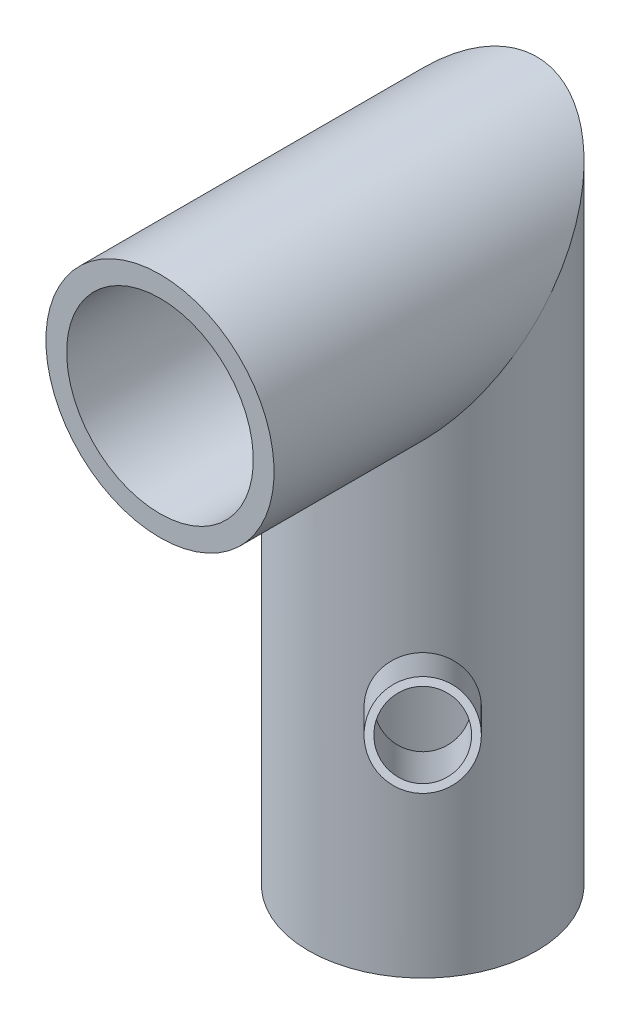
ISO-10303-21;
HEADER;
FILE_DESCRIPTION(('STEP AP214'),'2;1');
FILE_NAME('part.step','',(''),(''),'','','');
FILE_SCHEMA(('AUTOMOTIVE_DESIGN { 1 0 10303 214 1 1 1 1 }'));
ENDSEC;
DATA;
#1=APPLICATION_CONTEXT('core data for automotive mechanical design processes');
#2=APPLICATION_PROTOCOL_DEFINITION('international standard','automotive_design',2000,#1);
#3=PRODUCT_CONTEXT('',#1,'mechanical');
#4=PRODUCT('Part','Part','',(#3));
#5=PRODUCT_RELATED_PRODUCT_CATEGORY('part','',(#4));
#6=PRODUCT_DEFINITION_FORMATION('','',#4);
#7=PRODUCT_DEFINITION_CONTEXT('part definition',#1,'design');
#8=PRODUCT_DEFINITION('design','',#6,#7);
#9=PRODUCT_DEFINITION_SHAPE('','',#8);
#10=(LENGTH_UNIT() NAMED_UNIT(*) SI_UNIT(.MILLI.,.METRE.));
#11=(NAMED_UNIT(*) PLANE_ANGLE_UNIT() SI_UNIT($,.RADIAN.));
#12=(NAMED_UNIT(*) SI_UNIT($,.STERADIAN.) SOLID_ANGLE_UNIT());
#13=UNCERTAINTY_MEASURE_WITH_UNIT(LENGTH_MEASURE(1.E-05),#10,'distance_accuracy_value','');
#14=(GEOMETRIC_REPRESENTATION_CONTEXT(3) GLOBAL_UNCERTAINTY_ASSIGNED_CONTEXT((#13)) GLOBAL_UNIT_ASSIGNED_CONTEXT((#10,
#11,#12)) REPRESENTATION_CONTEXT('',''));
#15=CARTESIAN_POINT('',(0.,0.,0.));
#16=DIRECTION('',(0.,0.,1.));
#17=DIRECTION('',(1.,0.,0.));
#18=AXIS2_PLACEMENT_3D('',#15,#16,#17);
#19=CARTESIAN_POINT('',(0.,14.95,-38.));
#20=DIRECTION('',(0.,-1.,0.));
#21=DIRECTION('',(0.,0.,-1.));
#22=AXIS2_PLACEMENT_3D('',#19,#20,#21);
#23=CYLINDRICAL_SURFACE('',#22,13.5);
#24=CARTESIAN_POINT('',(12.4026078314168,-47.5303689872121,-32.6684599804486));
#25=CARTESIAN_POINT('',(12.4026074541691,-47.6854969967618,-32.6684603417958));
#26=CARTESIAN_POINT('',(12.400334372549,-47.8406194324453,-32.6631619201947));
#27=CARTESIAN_POINT('',(12.3909840963077,-48.1499320245815,-32.641487287225));
#28=CARTESIAN_POINT('',(12.3839079176055,-48.3041223712267,-32.6251134184634));
#29=CARTESIAN_POINT('',(12.3646204579696,-48.6106845041856,-32.5808908781653));
#30=CARTESIAN_POINT('',(12.3524044394549,-48.7630544790034,-32.5530316205989));
#31=CARTESIAN_POINT('',(12.3224671169421,-49.0645780364804,-32.4856402809017));
#32=CARTESIAN_POINT('',(12.3047484765567,-49.2137331380621,-32.4461138468707));
#33=CARTESIAN_POINT('',(12.2632667380413,-49.5085387002859,-32.3551081619502));
#34=CARTESIAN_POINT('',(12.2394667201007,-49.6541615833996,-32.303556076458));
#35=CARTESIAN_POINT('',(12.1854537929432,-49.9395776520134,-32.1889134354223));
#36=CARTESIAN_POINT('',(12.155240696561,-50.079370667227,-32.125822543127));
#37=CARTESIAN_POINT('',(12.0880206078433,-50.3516999511084,-31.988712327881));
#38=CARTESIAN_POINT('',(12.0510168948845,-50.4842396826499,-31.9146982833866));
#39=CARTESIAN_POINT('',(11.9698638507772,-50.7408390749606,-31.7565836887572));
#40=CARTESIAN_POINT('',(11.9257152175218,-50.8648995622738,-31.6724841239513));
#41=CARTESIAN_POINT('',(11.8347972884385,-51.0914568316449,-31.5041720250416));
#42=CARTESIAN_POINT('',(11.7887303840513,-51.1948697076169,-31.420810066597));
#43=CARTESIAN_POINT('',(11.6904756325528,-51.3931458907392,-31.2477652220097));
#44=CARTESIAN_POINT('',(11.6382879869771,-51.4880094792073,-31.158082544026));
#45=CARTESIAN_POINT('',(11.5277491947446,-51.6685468415771,-30.9734380377897));
#46=CARTESIAN_POINT('',(11.4693984258321,-51.75422117805,-30.8784765332508));
#47=CARTESIAN_POINT('',(11.3465636127386,-51.9158659434795,-30.6843535136399));
#48=CARTESIAN_POINT('',(11.2820795646457,-51.9918363662465,-30.5851919958891));
#49=CARTESIAN_POINT('',(11.1491907925894,-52.1314530480085,-30.3868964967247));
#50=CARTESIAN_POINT('',(11.0809694577194,-52.1954082320999,-30.2878568623697));
#51=CARTESIAN_POINT('',(10.9390399288838,-52.3135312475122,-30.0878291810284));
#52=CARTESIAN_POINT('',(10.8653299115801,-52.3676958057258,-29.9868404948957));
#53=CARTESIAN_POINT('',(10.7127329433701,-52.4659592990457,-29.7839511622829));
#54=CARTESIAN_POINT('',(10.6338479178096,-52.5100619506138,-29.6820508670137));
#55=CARTESIAN_POINT('',(10.4711841437759,-52.588067479258,-29.4781860205935));
#56=CARTESIAN_POINT('',(10.3874035854576,-52.6219665552873,-29.3762214596414));
#57=CARTESIAN_POINT('',(10.2144191902217,-52.6797416731073,-29.1719906508406));
#58=CARTESIAN_POINT('',(10.1251648422911,-52.7035003523885,-29.0697339718112));
#59=CARTESIAN_POINT('',(9.94257804384494,-52.7403570303557,-28.8668860715334));
#60=CARTESIAN_POINT('',(9.84924409352779,-52.7534510730264,-28.7662954818586));
#61=CARTESIAN_POINT('',(9.65914598360358,-52.7689160635626,-28.5676198563692));
#62=CARTESIAN_POINT('',(9.56238287579438,-52.7712902712331,-28.46953406789));
#63=CARTESIAN_POINT('',(9.36602836625288,-52.7653152624475,-28.2764988641334));
#64=CARTESIAN_POINT('',(9.26643593103245,-52.7569620769634,-28.1815506230522));
#65=CARTESIAN_POINT('',(9.06448702259583,-52.7294574375191,-27.9947952083692));
#66=CARTESIAN_POINT('',(8.96211601937286,-52.7102303217267,-27.9030148771585));
#67=CARTESIAN_POINT('',(8.75608001119253,-52.6609826959472,-27.7238280423705));
#68=CARTESIAN_POINT('',(8.65241453851432,-52.6309581688869,-27.63642318045));
#69=CARTESIAN_POINT('',(8.44476044935031,-52.5602421552339,-27.4665290032329));
#70=CARTESIAN_POINT('',(8.3407719630524,-52.5195545239491,-27.3840379245319));
#71=CARTESIAN_POINT('',(8.13335156550347,-52.4276525590633,-27.2242988869962));
#72=CARTESIAN_POINT('',(8.02991987239983,-52.3764343696624,-27.1470528624767));
#73=CARTESIAN_POINT('',(7.82497391174662,-52.2638750327092,-26.998374544241));
#74=CARTESIAN_POINT('',(7.7234547292238,-52.202565472313,-26.9269251166221));
#75=CARTESIAN_POINT('',(7.52304188151515,-52.0700012565373,-26.7897999647342));
#76=CARTESIAN_POINT('',(7.4241482220684,-51.998746579421,-26.7241242530852));
#77=CARTESIAN_POINT('',(7.23005569694352,-51.8466735334161,-26.5986998304025));
#78=CARTESIAN_POINT('',(7.13485619658613,-51.7658568170918,-26.5389500984799));
#79=CARTESIAN_POINT('',(6.94918022996923,-51.5951128657466,-26.4254270982168));
#80=CARTESIAN_POINT('',(6.85870381411513,-51.505185533526,-26.3716538936516));
#81=CARTESIAN_POINT('',(6.68458467795714,-51.3179564873399,-26.270706278384));
#82=CARTESIAN_POINT('',(6.60087041903308,-51.2207615405435,-26.223457492317));
#83=CARTESIAN_POINT('',(6.43992623531879,-51.0186794219643,-26.1346808503835));
#84=CARTESIAN_POINT('',(6.36269850584276,-50.9137896682563,-26.0931549283521));
#85=CARTESIAN_POINT('',(6.14210202507236,-50.588745601449,-25.9770122844505));
#86=CARTESIAN_POINT('',(6.00960944981806,-50.35799129665,-25.9107115709561));
#87=CARTESIAN_POINT('',(5.77873142359058,-49.875141079403,-25.7986519620855));
#88=CARTESIAN_POINT('',(5.68040484227466,-49.6230092529747,-25.752928482669));
#89=CARTESIAN_POINT('',(5.52012491089038,-49.1049302765901,-25.6798548812142));
#90=CARTESIAN_POINT('',(5.45818366669196,-48.8389785605763,-25.6525108738268));
#91=CARTESIAN_POINT('',(5.36704153470343,-48.2802896272205,-25.6126044783384));
#92=CARTESIAN_POINT('',(5.34059283572848,-47.9870237108228,-25.6012812682938));
#93=CARTESIAN_POINT('',(5.32640278543088,-47.3994949021746,-25.5951866373963));
#94=CARTESIAN_POINT('',(5.33867732826364,-47.1052316500774,-25.600422013103));
#95=CARTESIAN_POINT('',(5.40324072545171,-46.4718777907522,-25.628400362429));
#96=CARTESIAN_POINT('',(5.46191281261176,-46.1335724269655,-25.6539400372047));
#97=CARTESIAN_POINT('',(5.62135686566214,-45.4688686989215,-25.7257201379023));
#98=CARTESIAN_POINT('',(5.7221898998651,-45.1424883562417,-25.7719905984552));
#99=CARTESIAN_POINT('',(5.91225275122181,-44.6376974805767,-25.8632238912822));
#100=CARTESIAN_POINT('',(5.98939674128537,-44.4533042740524,-25.9009998885907));
#101=CARTESIAN_POINT('',(6.15598936012938,-44.0920237748887,-25.9849047217123));
#102=CARTESIAN_POINT('',(6.2454410939255,-43.9151383911152,-26.0310356662558));
#103=CARTESIAN_POINT('',(6.4358594255096,-43.57057446576,-26.1323408910982));
#104=CARTESIAN_POINT('',(6.53681574985254,-43.4028879049657,-26.1875071219633));
#105=CARTESIAN_POINT('',(6.74961335443817,-43.0784574827738,-26.3077954397259));
#106=CARTESIAN_POINT('',(6.86144937861573,-42.9217083996359,-26.3729127277875));
#107=CARTESIAN_POINT('',(7.13754393559966,-42.5672070879633,-26.5396311762954));
#108=CARTESIAN_POINT('',(7.30619376187534,-42.3749747804435,-26.6459321882974));
#109=CARTESIAN_POINT('',(7.65996402594364,-42.0226458161367,-26.8815485606488));
#110=CARTESIAN_POINT('',(7.84505452726815,-41.8624924114211,-27.0108225029612));
#111=CARTESIAN_POINT('',(8.18946166243426,-41.6120091999844,-27.2659954732622));
#112=CARTESIAN_POINT('',(8.34652594435429,-41.5141203922941,-27.3873950161002));
#113=CARTESIAN_POINT('',(8.58519875311291,-41.3918988171499,-27.5810312880686));
#114=CARTESIAN_POINT('',(8.6652854762031,-41.3552553468859,-27.6475140461362));
#115=CARTESIAN_POINT('',(8.82590530402713,-41.2908319266414,-27.784106214345));
#116=CARTESIAN_POINT('',(8.90643819518223,-41.2630480553546,-27.8542140040148));
#117=CARTESIAN_POINT('',(9.06786199905286,-41.2167577304496,-27.9982170823375));
#118=CARTESIAN_POINT('',(9.1487514237481,-41.1983181801433,-28.072135622064));
#119=CARTESIAN_POINT('',(9.30957707845439,-41.1714389634874,-28.2227861262555));
#120=CARTESIAN_POINT('',(9.38951331059243,-41.1629992748196,-28.2995180844409));
#121=CARTESIAN_POINT('',(9.54766159384255,-41.1563281168575,-28.4551342532596));
#122=CARTESIAN_POINT('',(9.62587406328277,-41.158094142805,-28.5340179310728));
#123=CARTESIAN_POINT('',(9.77989213205746,-41.1717846887576,-28.6932295171079));
#124=CARTESIAN_POINT('',(9.85569787112077,-41.1837086178971,-28.7735573410606));
#125=CARTESIAN_POINT('',(9.99648478976908,-41.2156511697138,-28.9264159965119));
#126=CARTESIAN_POINT('',(10.0617659573556,-41.2346866602824,-28.9988784170614));
#127=CARTESIAN_POINT('',(10.1896000199108,-41.2803087456312,-29.1438492250523));
#128=CARTESIAN_POINT('',(10.2521520701405,-41.3068976595471,-29.2163576197764));
#129=CARTESIAN_POINT('',(10.4352939525749,-41.3973444910672,-29.4331830924972));
#130=CARTESIAN_POINT('',(10.5514430690592,-41.4718999317028,-29.5768807422622));
#131=CARTESIAN_POINT('',(10.8097459491445,-41.6761668190758,-29.9093769353369));
#132=CARTESIAN_POINT('',(10.9464888088761,-41.8160629892657,-30.0960718982738));
#133=CARTESIAN_POINT('',(11.1970930302643,-42.1303679542441,-30.4552458200784));
#134=CARTESIAN_POINT('',(11.31090592612,-42.3048483361176,-30.6276942224771));
#135=CARTESIAN_POINT('',(11.5551207242683,-42.7476087389883,-31.0143900640029));
#136=CARTESIAN_POINT('',(11.6767913214403,-43.0270667032233,-31.2213948120239));
#137=CARTESIAN_POINT('',(11.835224293157,-43.4715237609032,-31.5046853812515));
#138=CARTESIAN_POINT('',(11.8840671829756,-43.6240859070818,-31.5946709598506));
#139=CARTESIAN_POINT('',(11.974400265294,-43.9365529803919,-31.7651735419386));
#140=CARTESIAN_POINT('',(12.0158913114453,-44.0964570523051,-31.8456916443675));
#141=CARTESIAN_POINT('',(12.0929776150367,-44.4264217610584,-31.9985507422124));
#142=CARTESIAN_POINT('',(12.1284053950368,-44.5966346929328,-32.0706459323219));
#143=CARTESIAN_POINT('',(12.1925708815713,-44.9426028706715,-32.2037362607105));
#144=CARTESIAN_POINT('',(12.2213077099216,-45.1183588406232,-32.264729941693));
#145=CARTESIAN_POINT('',(12.2723343812719,-45.4740278954434,-32.3747464292898));
#146=CARTESIAN_POINT('',(12.2946394829789,-45.6539300293391,-32.4237975248425));
#147=CARTESIAN_POINT('',(12.3330565161284,-46.0173528883812,-32.509288281249));
#148=CARTESIAN_POINT('',(12.3491689535069,-46.2008733166273,-32.5457289723394));
#149=CARTESIAN_POINT('',(12.3754968314798,-46.5745392040742,-32.6057272318372));
#150=CARTESIAN_POINT('',(12.3855771701625,-46.7647420990925,-32.6289890639318));
#151=CARTESIAN_POINT('',(12.3991344326744,-47.1467553632444,-32.6603587244741));
#152=CARTESIAN_POINT('',(12.4026082978515,-47.3385664356722,-32.6684595336737));
#153=CARTESIAN_POINT('',(12.4026078314168,-47.5303689872121,-32.6684599804486));
#154=B_SPLINE_CURVE_WITH_KNOTS('',3,(#24,#25,#26,#27,#28,#29,#30,#31,#32,#33,#34,#35,#36,#37,
#38,#39,#40,#41,#42,#43,#44,#45,#46,#47,#48,#49,#50,#51,#52,#53,#54,#55,#56,#57,#58,#59,#60,#61,
#62,#63,#64,#65,#66,#67,#68,#69,#70,#71,#72,#73,#74,#75,#76,#77,#78,#79,#80,#81,#82,#83,#84,#85,
#86,#87,#88,#89,#90,#91,#92,#93,#94,#95,#96,#97,#98,#99,#100,#101,#102,#103,#104,#105,#106,#107,
#108,#109,#110,#111,#112,#113,#114,#115,#116,#117,#118,#119,#120,#121,#122,#123,#124,#125,#126,
#127,#128,#129,#130,#131,#132,#133,#134,#135,#136,#137,#138,#139,#140,#141,#142,#143,#144,#145,
#146,#147,#148,#149,#150,#151,#152,#153),.UNSPECIFIED.,.T.,.F.,(4,2,2,2,2,2,2,2,2,2,2,2,2,2,2,2,
2,2,2,2,2,2,2,2,2,2,2,2,2,2,2,2,2,2,2,2,2,2,2,2,2,2,2,2,2,2,2,2,2,2,2,2,2,2,2,2,2,2,2,2,2,2,2,2,
4),(0.,0.465254941343188,0.930411505726324,1.39599776470033,1.8613590012054,2.32961548689747,
2.79788564049441,3.26593024574564,3.73392916145318,4.15517566250802,4.57640829721045,
4.99761512908205,5.41882222960997,5.82697834852706,6.23527066689253,6.64341193353689,
7.05170505376994,7.4646033199401,7.87765467982995,8.29058042606382,8.70365899470608,
9.1196478030535,9.53579153642565,9.95178501766551,10.3679310884698,10.7827985164037,
11.1976668511124,11.6124635904302,12.0272647556113,12.4368578019805,12.846588917918,
13.6650723525164,14.4849591605463,15.3051186011886,16.1857782205861,17.0667993583141,
18.0960104031645,19.1267174085563,19.7363877968111,20.3462122765918,20.9554963967019,
21.56448761515,22.3924303802783,23.2188953126581,23.8800072478935,24.2106960359563,
24.5412382555621,24.8741147833061,25.2069905681151,25.5397846596813,25.8725593945792,
26.1703385381352,26.4682092081415,27.0636235345366,27.8704612016278,28.6789867475518,
29.7780017533409,30.3288314978377,30.8795972413576,31.4437263828484,32.0079295243227,
32.5707829183475,33.133590317888,33.7085722278101,34.2838202769873),.UNSPECIFIED.);
#155=CARTESIAN_POINT('',(12.3926489596014,-48.0856946764748,-32.6453523211989));
#156=VERTEX_POINT('',#155);
#157=CARTESIAN_POINT('',(5.3546476788011,-48.0856946764748,-25.6073510403986));
#158=VERTEX_POINT('',#157);
#159=EDGE_CURVE('E70',#156,#158,#154,.T.);
#160=ORIENTED_EDGE('',*,*,#159,.F.);
#161=CARTESIAN_POINT('',(0.,-26.8211631573543,-38.));
#162=DIRECTION('',(0.60896972058243,0.508243798611957,0.608969720582432));
#163=DIRECTION('',(0.359382636494524,-0.861213237922228,0.359382636494525));
#164=AXIS2_PLACEMENT_3D('',#161,#162,#163);
#165=ELLIPSE('',#164,26.5620555270311,13.5);
#166=CARTESIAN_POINT('',(12.7891736212475,-47.3245213718715,-33.6771493102829));
#167=VERTEX_POINT('',#166);
#168=EDGE_CURVE('E64',#156,#167,#165,.T.);
#169=ORIENTED_EDGE('',*,*,#168,.T.);
#170=CARTESIAN_POINT('',(4.32285068971703,-47.3245213718714,-25.2108263787525));
#171=CARTESIAN_POINT('',(4.33049087348776,-47.1970837071915,-25.2134121435329));
#172=CARTESIAN_POINT('',(4.34115671539952,-47.0698773314985,-25.2170212349891));
#173=CARTESIAN_POINT('',(4.36826339454839,-46.8161804815477,-25.2262575092941));
#174=CARTESIAN_POINT('',(4.38470300278998,-46.689689860753,-25.2318842626715));
#175=CARTESIAN_POINT('',(4.44223057391352,-46.3118824044159,-25.2517351503151));
#176=CARTESIAN_POINT('',(4.49154627670616,-46.0619335488827,-25.2689360396316));
#177=CARTESIAN_POINT('',(4.61022953573521,-45.5667494213795,-25.3114322363188));
#178=CARTESIAN_POINT('',(4.67966280495566,-45.3215324516387,-25.3367540998791));
#179=CARTESIAN_POINT('',(4.83674197388976,-44.8379937038327,-25.3959144191036));
#180=CARTESIAN_POINT('',(4.92439250032019,-44.5996736949703,-25.4297550387756));
#181=CARTESIAN_POINT('',(5.11182313609656,-44.1426060742573,-25.5048425031274));
#182=CARTESIAN_POINT('',(5.21082404341832,-43.9234672907503,-25.5456584558186));
#183=CARTESIAN_POINT('',(5.42295775559721,-43.4941165961153,-25.6365518630977));
#184=CARTESIAN_POINT('',(5.53609060474737,-43.2839047129691,-25.6866293467137));
#185=CARTESIAN_POINT('',(5.77551029115772,-42.8742549325098,-25.7970967687386));
#186=CARTESIAN_POINT('',(5.9017810426554,-42.6748043035407,-25.8574741528068));
#187=CARTESIAN_POINT('',(6.16678033039424,-42.288559909502,-25.9898898336715));
#188=CARTESIAN_POINT('',(6.30550364639291,-42.1017608978328,-26.0619232542091));
#189=CARTESIAN_POINT('',(6.64385708914377,-41.6824727380925,-26.2459427084292));
#190=CARTESIAN_POINT('',(6.84818927491438,-41.4559694005607,-26.3631936864967));
#191=CARTESIAN_POINT('',(7.27519579344283,-41.0393548915769,-26.6252875716182));
#192=CARTESIAN_POINT('',(7.49783540644316,-40.8491770070207,-26.770078903974));
#193=CARTESIAN_POINT('',(7.90932785576645,-40.5515249274917,-27.0573522041801));
#194=CARTESIAN_POINT('',(8.09559795627285,-40.4350775853358,-27.1940718351037));
#195=CARTESIAN_POINT('',(8.37816033245533,-40.2885456107815,-27.4136540520406));
#196=CARTESIAN_POINT('',(8.47289423538207,-40.2443851380398,-27.4892826709557));
#197=CARTESIAN_POINT('',(8.66272340718244,-40.1662780148146,-27.6451809584265));
#198=CARTESIAN_POINT('',(8.75781849071722,-40.1323266965384,-27.7254484859222));
#199=CARTESIAN_POINT('',(8.94835040104432,-40.0751480573,-27.8909408372198));
#200=CARTESIAN_POINT('',(9.0437837778276,-40.0520096299478,-27.9762004844135));
#201=CARTESIAN_POINT('',(9.2333150017153,-40.0174352301393,-28.1505093953528));
#202=CARTESIAN_POINT('',(9.32741285453287,-40.0059992076071,-28.2395586428805));
#203=CARTESIAN_POINT('',(9.51331648505085,-39.9951336530155,-28.4206658163918));
#204=CARTESIAN_POINT('',(9.60512308002887,-39.9956997767666,-28.5127226417339));
#205=CARTESIAN_POINT('',(9.78561579703624,-40.008812814534,-28.6990032011851));
#206=CARTESIAN_POINT('',(9.87430213739011,-40.0213588885764,-28.79322678292));
#207=CARTESIAN_POINT('',(10.0374942689583,-40.0559120985559,-28.9716259368893));
#208=CARTESIAN_POINT('',(10.1124316465116,-40.0766156820721,-29.0556629011306));
#209=CARTESIAN_POINT('',(10.2589545618928,-40.1266607559985,-29.2241050473495));
#210=CARTESIAN_POINT('',(10.3305390620211,-40.156004900412,-29.3085103346007));
#211=CARTESIAN_POINT('',(10.539799525958,-40.2562487385747,-29.5613753131713));
#212=CARTESIAN_POINT('',(10.6720622585996,-40.3393775618788,-29.729571870855));
#213=CARTESIAN_POINT('',(10.9676288795921,-40.5696459911389,-30.1232962824087));
#214=CARTESIAN_POINT('',(11.1240284805883,-40.7290982577118,-30.3467259651775));
#215=CARTESIAN_POINT('',(11.4092257735473,-41.0880693892294,-30.7787167607425));
#216=CARTESIAN_POINT('',(11.5379624892182,-41.2876749262891,-30.9872443641405));
#217=CARTESIAN_POINT('',(11.7366842655702,-41.653810989748,-31.3271627385792));
#218=CARTESIAN_POINT('',(11.8128208947041,-41.8128427094788,-31.4632237507218));
#219=CARTESIAN_POINT('',(11.9542072322588,-42.1434724336142,-31.7255165912828));
#220=CARTESIAN_POINT('',(12.0194523143536,-42.3150757336561,-31.8517442307685));
#221=CARTESIAN_POINT('',(12.1402757728816,-42.6690206056962,-32.0938981012325));
#222=CARTESIAN_POINT('',(12.1958384978374,-42.8513789379082,-32.2098075076041));
#223=CARTESIAN_POINT('',(12.2982036098132,-43.2249903112227,-32.430531351533));
#224=CARTESIAN_POINT('',(12.3450072001501,-43.4162421260383,-32.5353473122305));
#225=CARTESIAN_POINT('',(12.4321369661881,-43.8127776847298,-32.7365056286127));
#226=CARTESIAN_POINT('',(12.4722017287037,-44.0183156975159,-32.8324595336384));
#227=CARTESIAN_POINT('',(12.5447117117264,-44.4364354620794,-33.0110626359786));
#228=CARTESIAN_POINT('',(12.5771557065583,-44.6490183406424,-33.0937096924339));
#229=CARTESIAN_POINT('',(12.6349256900127,-45.0795941357715,-33.2444606835483));
#230=CARTESIAN_POINT('',(12.6602701210896,-45.2975714037718,-33.3126021863299));
#231=CARTESIAN_POINT('',(12.7043299993098,-45.7383598423204,-33.4333683811116));
#232=CARTESIAN_POINT('',(12.7230484335481,-45.9611687864785,-33.4860000633652));
#233=CARTESIAN_POINT('',(12.7515007165986,-46.3735272281288,-33.5670790427137));
#234=CARTESIAN_POINT('',(12.7622068374655,-46.5625067897934,-33.5980824691405));
#235=CARTESIAN_POINT('',(12.7790944307858,-46.942322137143,-33.6473798785361));
#236=CARTESIAN_POINT('',(12.7852755619064,-47.1331580617588,-33.6656729027174));
#237=CARTESIAN_POINT('',(12.7891736212475,-47.3245213718714,-33.6771493102829));
#238=B_SPLINE_CURVE_WITH_KNOTS('',3,(#170,#171,#172,#173,#174,#175,#176,#177,#178,#179,#180,
#181,#182,#183,#184,#185,#186,#187,#188,#189,#190,#191,#192,#193,#194,#195,#196,#197,#198,#199,
#200,#201,#202,#203,#204,#205,#206,#207,#208,#209,#210,#211,#212,#213,#214,#215,#216,#217,#218,
#219,#220,#221,#222,#223,#224,#225,#226,#227,#228,#229,#230,#231,#232,#233,#234,#235,#236,#237),
.UNSPECIFIED.,.F.,.F.,(4,2,2,2,2,2,2,2,2,2,2,2,2,2,2,2,2,2,2,2,2,2,2,2,2,2,2,2,2,2,2,2,2,4),(0.,
0.382986735047625,0.765891997453906,1.53081482079575,2.29826494957203,3.06591022972714,
3.79689424090696,4.52788054323022,5.2579821453118,5.98777909806513,6.96504605035023,
7.94050058367176,8.71342411517325,9.10004841014998,9.4864956644445,9.87606634337762,
10.2656353552862,10.6550633646904,11.0444640713664,11.3875254338187,11.7306922798725,
12.4166703182656,13.3593384514433,14.3040636294133,14.9713788615511,15.6389768272076,
16.3076441475585,16.9762195398438,17.6666261569347,18.3571437386597,19.04585057548,
19.7342465367261,20.3091980028597,20.8841928347703),.UNSPECIFIED.);
#239=CARTESIAN_POINT('',(4.32285068971703,-47.3245213718714,-25.2108263787525));
#240=VERTEX_POINT('',#239);
#241=EDGE_CURVE('E77',#240,#167,#238,.T.);
#242=ORIENTED_EDGE('',*,*,#241,.F.);
#243=EDGE_CURVE('E12',#240,#158,#165,.T.);
#244=ORIENTED_EDGE('',*,*,#243,.T.);
#245=EDGE_LOOP('',(#160,#169,#242,#244));
#246=FACE_BOUND('',#245,.T.);
#247=CARTESIAN_POINT('',(0.,0.,-38.));
#248=DIRECTION('',(0.,-0.707106781186548,-0.707106781186548));
#249=DIRECTION('',(0.,0.707106781186548,-0.707106781186548));
#250=AXIS2_PLACEMENT_3D('',#247,#248,#249);
#251=ELLIPSE('',#250,19.0918830920368,13.5);
#252=CARTESIAN_POINT('',(0.,13.5,-51.5));
#253=VERTEX_POINT('',#252);
#254=EDGE_CURVE('E178',#253,#253,#251,.T.);
#255=ORIENTED_EDGE('',*,*,#254,.F.);
#256=EDGE_LOOP('',(#255));
#257=FACE_BOUND('',#256,.T.);
#258=CARTESIAN_POINT('',(0.,-79.,-38.));
#259=DIRECTION('',(0.,1.,0.));
#260=DIRECTION('',(0.,0.,1.));
#261=AXIS2_PLACEMENT_3D('',#258,#259,#260);
#262=CIRCLE('',#261,13.5);
#263=CARTESIAN_POINT('',(0.,-79.,-24.5));
#264=VERTEX_POINT('',#263);
#265=EDGE_CURVE('E138',#264,#264,#262,.T.);
#266=ORIENTED_EDGE('',*,*,#265,.F.);
#267=EDGE_LOOP('',(#266));
#268=FACE_BOUND('',#267,.T.);
#269=ADVANCED_FACE('F55',(#246,#257,#268),#23,.F.);
#270=CARTESIAN_POINT('',(0.,-79.,-38.));
#271=DIRECTION('',(0.,1.,0.));
#272=DIRECTION('',(0.,0.,1.));
#273=AXIS2_PLACEMENT_3D('',#270,#271,#272);
#274=PLANE('',#273);
#275=ORIENTED_EDGE('',*,*,#265,.T.);
#276=EDGE_LOOP('',(#275));
#277=FACE_BOUND('',#276,.T.);
#278=CARTESIAN_POINT('',(0.,-79.,-38.));
#279=DIRECTION('',(0.,1.,0.));
#280=DIRECTION('',(0.,0.,1.));
#281=AXIS2_PLACEMENT_3D('',#278,#279,#280);
#282=CIRCLE('',#281,16.5);
#283=CARTESIAN_POINT('',(0.,-79.,-21.5));
#284=VERTEX_POINT('',#283);
#285=EDGE_CURVE('E175',#284,#284,#282,.T.);
#286=ORIENTED_EDGE('',*,*,#285,.F.);
#287=EDGE_LOOP('',(#286));
#288=FACE_BOUND('',#287,.T.);
#289=ADVANCED_FACE('F149',(#277,#288),#274,.F.);
#290=CARTESIAN_POINT('',(0.,0.,0.));
#291=DIRECTION('',(0.,0.,1.));
#292=DIRECTION('',(0.,-1.,0.));
#293=AXIS2_PLACEMENT_3D('',#290,#291,#292);
#294=PLANE('',#293);
#295=CARTESIAN_POINT('',(0.,0.,0.));
#296=DIRECTION('',(0.,0.,1.));
#297=DIRECTION('',(0.,-1.,0.));
#298=AXIS2_PLACEMENT_3D('',#295,#296,#297);
#299=CIRCLE('',#298,13.5);
#300=CARTESIAN_POINT('',(0.,-13.5,0.));
#301=VERTEX_POINT('',#300);
#302=EDGE_CURVE('E141',#301,#301,#299,.T.);
#303=ORIENTED_EDGE('',*,*,#302,.F.);
#304=EDGE_LOOP('',(#303));
#305=FACE_BOUND('',#304,.T.);
#306=CARTESIAN_POINT('',(0.,0.,0.));
#307=DIRECTION('',(0.,0.,1.));
#308=DIRECTION('',(0.,-1.,0.));
#309=AXIS2_PLACEMENT_3D('',#306,#307,#308);
#310=CIRCLE('',#309,16.5);
#311=CARTESIAN_POINT('',(0.,-16.5,0.));
#312=VERTEX_POINT('',#311);
#313=EDGE_CURVE('E105',#312,#312,#310,.T.);
#314=ORIENTED_EDGE('',*,*,#313,.T.);
#315=EDGE_LOOP('',(#314));
#316=FACE_BOUND('',#315,.T.);
#317=ADVANCED_FACE('F147',(#305,#316),#294,.T.);
#318=CARTESIAN_POINT('',(0.,14.95,-38.));
#319=DIRECTION('',(0.,-1.,0.));
#320=DIRECTION('',(0.,0.,-1.));
#321=AXIS2_PLACEMENT_3D('',#318,#319,#320);
#322=CYLINDRICAL_SURFACE('',#321,16.5);
#323=CARTESIAN_POINT('',(15.1111732467614,-45.8599592696054,-31.3741081274772));
#324=CARTESIAN_POINT('',(15.1111729579694,-46.0469303444637,-31.3741083161626));
#325=CARTESIAN_POINT('',(15.1083826385356,-46.2338991773003,-31.3677326456383));
#326=CARTESIAN_POINT('',(15.0969108907633,-46.6067158200159,-31.3416600389857));
#327=CARTESIAN_POINT('',(15.0882304714256,-46.7925638163989,-31.3219653844618));
#328=CARTESIAN_POINT('',(15.0645796281478,-47.1620824055914,-31.2687824700243));
#329=CARTESIAN_POINT('',(15.0496028275695,-47.3457505963715,-31.2352802272023));
#330=CARTESIAN_POINT('',(15.0129167898582,-47.7092047300064,-31.1542490145049));
#331=CARTESIAN_POINT('',(14.9912108744997,-47.8889925416444,-31.1067269659552));
#332=CARTESIAN_POINT('',(14.9404201329738,-48.2443360909516,-30.9973216326561));
#333=CARTESIAN_POINT('',(14.9112903962427,-48.4198586826339,-30.9353511433345));
#334=CARTESIAN_POINT('',(14.8452165013655,-48.763871028942,-30.7975434299328));
#335=CARTESIAN_POINT('',(14.8082721016917,-48.9323605660047,-30.7217057772701));
#336=CARTESIAN_POINT('',(14.7261209793377,-49.2605740910582,-30.5568939719087));
#337=CARTESIAN_POINT('',(14.6809185456867,-49.4203025735998,-30.4679266430449));
#338=CARTESIAN_POINT('',(14.5818378232538,-49.7295149775037,-30.277857883743));
#339=CARTESIAN_POINT('',(14.5279604039281,-49.878999923393,-30.1767576695898));
#340=CARTESIAN_POINT('',(14.4171121304732,-50.151833081967,-29.9744907440508));
#341=CARTESIAN_POINT('',(14.3609990000368,-50.2762974496904,-29.8743557462184));
#342=CARTESIAN_POINT('',(14.2413786832352,-50.5148955547292,-29.666482948545));
#343=CARTESIAN_POINT('',(14.1778717599624,-50.6290296593684,-29.5587454192775));
#344=CARTESIAN_POINT('',(14.0434248816987,-50.8461826396639,-29.3369154825153));
#345=CARTESIAN_POINT('',(13.9724854249461,-50.9492022594388,-29.2228235012297));
#346=CARTESIAN_POINT('',(13.8232223459551,-51.1434942469461,-28.9895788668419));
#347=CARTESIAN_POINT('',(13.7448987347621,-51.23476663225,-28.8704262213098));
#348=CARTESIAN_POINT('',(13.5837719262529,-51.4021898696692,-28.6324447079498));
#349=CARTESIAN_POINT('',(13.5012066593968,-51.4787448309081,-28.5137386855798));
#350=CARTESIAN_POINT('',(13.3295289270442,-51.620051038031,-28.2739832638819));
#351=CARTESIAN_POINT('',(13.2404142886868,-51.6847983415033,-28.1529330967451));
#352=CARTESIAN_POINT('',(13.0560224466243,-51.8021474733025,-27.9097296929834));
#353=CARTESIAN_POINT('',(12.9607475781412,-51.8547538698519,-27.7875768892803));
#354=CARTESIAN_POINT('',(12.7643853285935,-51.9476546927504,-27.5431817861404));
#355=CARTESIAN_POINT('',(12.6632958057168,-51.9879445473795,-27.4209394703137));
#356=CARTESIAN_POINT('',(12.4548505465048,-52.0563576705615,-27.1762867342276));
#357=CARTESIAN_POINT('',(12.3474440669178,-52.0843607137746,-27.0538859177475));
#358=CARTESIAN_POINT('',(12.1278377146628,-52.1275366480944,-26.8110608472711));
#359=CARTESIAN_POINT('',(12.0156361835743,-52.1427050618566,-26.6906372973956));
#360=CARTESIAN_POINT('',(11.7871993594079,-52.1601397739085,-26.4527439650427));
#361=CARTESIAN_POINT('',(11.6709645235282,-52.1624075297864,-26.335273850363));
#362=CARTESIAN_POINT('',(11.4352520417222,-52.1540368023941,-26.1041073963073));
#363=CARTESIAN_POINT('',(11.3157743886073,-52.1433982905115,-25.9904110652982));
#364=CARTESIAN_POINT('',(11.0736071776999,-52.1091312651534,-25.7667426819166));
#365=CARTESIAN_POINT('',(10.9509008146256,-52.0854108585248,-25.656802886727));
#366=CARTESIAN_POINT('',(10.7041396257852,-52.0250165683701,-25.4422087086591));
#367=CARTESIAN_POINT('',(10.5800852837333,-51.9883471918081,-25.3375525012647));
#368=CARTESIAN_POINT('',(10.331612201347,-51.90218017819,-25.1340141684502));
#369=CARTESIAN_POINT('',(10.2071933438508,-51.8526778317057,-25.0351341791373));
#370=CARTESIAN_POINT('',(9.95922691773533,-51.7410774613342,-24.8436963632034));
#371=CARTESIAN_POINT('',(9.83567903533973,-51.6789842415697,-24.7511361431889));
#372=CARTESIAN_POINT('',(9.59091456989338,-51.5426398841522,-24.572892252559));
#373=CARTESIAN_POINT('',(9.46969290061012,-51.4684197491167,-24.4871918560757));
#374=CARTESIAN_POINT('',(9.23053805697508,-51.30810212869,-24.3227113780989));
#375=CARTESIAN_POINT('',(9.11260364028352,-51.222009205557,-24.2439286573488));
#376=CARTESIAN_POINT('',(8.88121828885225,-51.0383791018964,-24.0934183162291));
#377=CARTESIAN_POINT('',(8.767767505651,-50.9408415350028,-24.021690934195));
#378=CARTESIAN_POINT('',(8.54659119954482,-50.7348940743528,-23.8853743200666));
#379=CARTESIAN_POINT('',(8.43886560946529,-50.6264843082048,-23.8207850042107));
#380=CARTESIAN_POINT('',(8.23151210836176,-50.4007693309454,-23.6994237658677));
#381=CARTESIAN_POINT('',(8.13180626447235,-50.2835788513259,-23.6425715469742));
#382=CARTESIAN_POINT('',(7.9402224393574,-50.0400307424246,-23.5357370844684));
#383=CARTESIAN_POINT('',(7.84834435693231,-49.9136732316959,-23.4857547520351));
#384=CARTESIAN_POINT('',(7.67338884968508,-49.6527272156034,-23.3925042584507));
#385=CARTESIAN_POINT('',(7.590308662837,-49.5181413145287,-23.349233988109));
#386=CARTESIAN_POINT('',(7.43367380074568,-49.2416402944938,-23.2691399346264));
#387=CARTESIAN_POINT('',(7.36012266967436,-49.0997224758443,-23.2323185482581));
#388=CARTESIAN_POINT('',(7.22288561702217,-48.8090265586648,-23.1647108328844));
#389=CARTESIAN_POINT('',(7.15924402349878,-48.6602212912421,-23.1339514668188));
#390=CARTESIAN_POINT('',(7.04259713205797,-48.3573779494123,-23.0783378490837));
#391=CARTESIAN_POINT('',(6.9895956402767,-48.2033380254418,-23.0534857099416));
#392=CARTESIAN_POINT('',(6.89446531018431,-47.8911790382341,-23.0093659368704));
#393=CARTESIAN_POINT('',(6.85233513773212,-47.733060478154,-22.9900976176526));
#394=CARTESIAN_POINT('',(6.77893317033483,-47.4137594436867,-22.9568072957447));
#395=CARTESIAN_POINT('',(6.74766555133605,-47.2525758160403,-22.942787310538));
#396=CARTESIAN_POINT('',(6.66606149868549,-46.741173617464,-22.9063692451405));
#397=CARTESIAN_POINT('',(6.63522727554096,-46.3870051017092,-22.8929138818243));
#398=CARTESIAN_POINT('',(6.62018923061568,-45.6778307760546,-22.8863327674151));
#399=CARTESIAN_POINT('',(6.63600449535325,-45.3228246828352,-22.8932153375375));
#400=CARTESIAN_POINT('',(6.71602896192335,-44.5589129010624,-22.9285923345215));
#401=CARTESIAN_POINT('',(6.7879048144887,-44.1509457878765,-22.9605156119207));
#402=CARTESIAN_POINT('',(6.93368944543075,-43.5505238641039,-23.0274698933938));
#403=CARTESIAN_POINT('',(6.98869412147303,-43.3520931854878,-23.0530047628887));
#404=CARTESIAN_POINT('',(7.11065868544623,-42.9599223121628,-23.1106373761186));
#405=CARTESIAN_POINT('',(7.17761569238147,-42.766180999878,-23.1427335385864));
#406=CARTESIAN_POINT('',(7.33567412488409,-42.350472669606,-23.2200496057902));
#407=CARTESIAN_POINT('',(7.42895136765238,-42.1295750359705,-23.2665866802432));
#408=CARTESIAN_POINT('',(7.63024089041383,-41.6969821294209,-23.369818026509));
#409=CARTESIAN_POINT('',(7.73825690702742,-41.4852892081192,-23.4265148752054));
#410=CARTESIAN_POINT('',(7.96810240794015,-41.0731548087233,-23.5509029330103));
#411=CARTESIAN_POINT('',(8.08991840333106,-40.872702625024,-23.6185834335773));
#412=CARTESIAN_POINT('',(8.34660679567579,-40.4851842476299,-23.7660249144302));
#413=CARTESIAN_POINT('',(8.48147268848914,-40.2981114656031,-23.8457798878101));
#414=CARTESIAN_POINT('',(8.81290026399611,-39.8773188294202,-24.0489173817399));
#415=CARTESIAN_POINT('',(9.01455416058699,-39.6501379315695,-24.1778069189697));
#416=CARTESIAN_POINT('',(9.43722556949145,-39.2344364849897,-24.4628834149664));
#417=CARTESIAN_POINT('',(9.65820808927088,-39.0458480548246,-24.6190215330002));
#418=CARTESIAN_POINT('',(10.0700454325637,-38.7509654452977,-24.9272596876382));
#419=CARTESIAN_POINT('',(10.2583262724036,-38.6357879316381,-25.0741633625158));
#420=CARTESIAN_POINT('',(10.5442613939619,-38.4926932137654,-25.3081209158275));
#421=CARTESIAN_POINT('',(10.6401787519766,-38.4499345162055,-25.3883916100517));
#422=CARTESIAN_POINT('',(10.8324889235481,-38.3750753527875,-25.5531857954413));
#423=CARTESIAN_POINT('',(10.9288815097014,-38.3429702125386,-25.637707402666));
#424=CARTESIAN_POINT('',(11.122004907808,-38.2899043082008,-25.811153947568));
#425=CARTESIAN_POINT('',(11.2187336233295,-38.2690200818078,-25.9001047145319));
#426=CARTESIAN_POINT('',(11.4109986151471,-38.2392047002378,-26.081252134471));
#427=CARTESIAN_POINT('',(11.5065348935338,-38.2302735240998,-26.1734487817537));
#428=CARTESIAN_POINT('',(11.6955097770866,-38.2245816768001,-26.3602962314497));
#429=CARTESIAN_POINT('',(11.7889488087199,-38.2278185083459,-26.4549465263306));
#430=CARTESIAN_POINT('',(11.9729261891729,-38.246377934,-26.645854872309));
#431=CARTESIAN_POINT('',(12.0634646907647,-38.2616998904871,-26.742112838322));
#432=CARTESIAN_POINT('',(12.2320197118501,-38.3019351907959,-26.9256322267888));
#433=CARTESIAN_POINT('',(12.3103802519671,-38.325729895774,-27.0128256141534));
#434=CARTESIAN_POINT('',(12.4638112534041,-38.3823701054797,-27.1871873384085));
#435=CARTESIAN_POINT('',(12.5388806782405,-38.4152184381028,-27.2743556589397));
#436=CARTESIAN_POINT('',(12.7586595588551,-38.5265526529901,-27.5349096187613));
#437=CARTESIAN_POINT('',(12.8980274939661,-38.6178496320953,-27.7074404421561));
#438=CARTESIAN_POINT('',(13.2086839392008,-38.8677245771424,-28.1072757674383));
#439=CARTESIAN_POINT('',(13.3733619733528,-39.0386924778731,-28.3318983940911));
#440=CARTESIAN_POINT('',(13.6751512768936,-39.4222977862339,-28.7636594749193));
#441=CARTESIAN_POINT('',(13.8122040159864,-39.6350218210239,-28.9707602779186));
#442=CARTESIAN_POINT('',(14.0210265293687,-40.0181685637107,-29.3002536053361));
#443=CARTESIAN_POINT('',(14.0995965165124,-40.1801120977054,-29.4284264592456));
#444=CARTESIAN_POINT('',(14.2462531935252,-40.5162354706275,-29.6744494000924));
#445=CARTESIAN_POINT('',(14.3143361240419,-40.6904196650981,-29.7922957787456));
#446=CARTESIAN_POINT('',(14.4409404393558,-41.0492497373001,-30.0171492651805));
#447=CARTESIAN_POINT('',(14.4994495238931,-41.2339086690912,-30.1241423629062));
#448=CARTESIAN_POINT('',(14.6075792640618,-41.6119188456532,-30.3265529857029));
#449=CARTESIAN_POINT('',(14.6572009519085,-41.8052690777169,-30.4219718546317));
#450=CARTESIAN_POINT('',(14.7492603135391,-42.2039666004492,-30.6027137483313));
#451=CARTESIAN_POINT('',(14.7915041303449,-42.4094883064379,-30.6877504571652));
#452=CARTESIAN_POINT('',(14.867886657152,-42.8271042017869,-30.8443354527504));
#453=CARTESIAN_POINT('',(14.9020242578809,-43.0391992861786,-30.9158818931879));
#454=CARTESIAN_POINT('',(14.9624635775421,-43.4682934546122,-31.0444469443157));
#455=CARTESIAN_POINT('',(14.9887835099329,-43.6852798524452,-31.1014992774766));
#456=CARTESIAN_POINT('',(15.0338550785256,-44.1234106321128,-31.2002828755429));
#457=CARTESIAN_POINT('',(15.0526097781517,-44.3445532928903,-31.2420203413476));
#458=CARTESIAN_POINT('',(15.0819366202436,-44.7806958961633,-31.307733724014));
#459=CARTESIAN_POINT('',(15.0928128056822,-44.9955757962614,-31.3323678866542));
#460=CARTESIAN_POINT('',(15.1074330365898,-45.4269573936195,-31.3655589250223));
#461=CARTESIAN_POINT('',(15.1111735811623,-45.6434598346663,-31.3741079089926));
#462=CARTESIAN_POINT('',(15.1111732467614,-45.8599592696054,-31.3741081274772));
#463=B_SPLINE_CURVE_WITH_KNOTS('',3,(#323,#324,#325,#326,#327,#328,#329,#330,#331,#332,#333,
#334,#335,#336,#337,#338,#339,#340,#341,#342,#343,#344,#345,#346,#347,#348,#349,#350,#351,#352,
#353,#354,#355,#356,#357,#358,#359,#360,#361,#362,#363,#364,#365,#366,#367,#368,#369,#370,#371,
#372,#373,#374,#375,#376,#377,#378,#379,#380,#381,#382,#383,#384,#385,#386,#387,#388,#389,#390,
#391,#392,#393,#394,#395,#396,#397,#398,#399,#400,#401,#402,#403,#404,#405,#406,#407,#408,#409,
#410,#411,#412,#413,#414,#415,#416,#417,#418,#419,#420,#421,#422,#423,#424,#425,#426,#427,#428,
#429,#430,#431,#432,#433,#434,#435,#436,#437,#438,#439,#440,#441,#442,#443,#444,#445,#446,#447,
#448,#449,#450,#451,#452,#453,#454,#455,#456,#457,#458,#459,#460,#461,#462),.UNSPECIFIED.,.T.,
.F.,(4,2,2,2,2,2,2,2,2,2,2,2,2,2,2,2,2,2,2,2,2,2,2,2,2,2,2,2,2,2,2,2,2,2,2,2,2,2,2,2,2,2,2,2,2,
2,2,2,2,2,2,2,2,2,2,2,2,2,2,2,2,2,2,2,2,2,2,2,2,4),(0.,0.560765190134516,1.12143434288618,
1.68267268444146,2.24363441506838,2.80807376852196,3.37253056964817,3.9366950343149,
4.50080299038418,5.00811047884459,5.51539992135886,6.02265537956217,6.52991007900275,
7.02017353721423,7.510600389029,8.00084240746064,8.49126617622134,8.98638713530905,
9.48168074559844,9.9769183937478,10.472157139812,10.9709198122635,11.4695090582962,
11.9682815356789,12.4668640603486,12.9641913425633,13.4613280506788,13.9584815467448,
14.4556292083399,14.9471428881269,15.4386502125196,15.930002771956,16.4215375602487,
16.9152115834765,17.4090618884268,17.902851558633,18.3968308493777,19.4596327128847,
20.5228694793577,21.7643065504215,22.3863925356261,23.0083287748998,23.7402800838251,
24.4724173053352,25.2038449691764,25.9349099449973,26.9214049430602,27.9061495619763,
28.6980630597749,29.0941821183179,29.4901271438059,29.8887396807639,30.287351518712,
30.6858815523118,31.0843905605475,31.4428510229148,31.8014235773429,32.5181768659315,
33.4933777407227,34.4706235645952,35.1327413595001,35.7950959577515,36.4582949636724,
37.1214168931864,37.7999567588107,38.4785894238823,39.1556283931361,39.832392930034,
40.4814014857834,41.1307283770667),.UNSPECIFIED.);
#464=CARTESIAN_POINT('',(15.1111732467614,-45.8599592696054,-31.3741081274772));
#465=VERTEX_POINT('',#464);
#466=EDGE_CURVE('E130',#465,#465,#463,.T.);
#467=ORIENTED_EDGE('',*,*,#466,.T.);
#468=EDGE_LOOP('',(#467));
#469=FACE_BOUND('',#468,.T.);
#470=CARTESIAN_POINT('',(0.,0.,-38.));
#471=DIRECTION('',(0.,-0.707106781186547,-0.707106781186547));
#472=DIRECTION('',(0.,-0.707106781186548,0.707106781186547));
#473=AXIS2_PLACEMENT_3D('',#470,#471,#472);
#474=ELLIPSE('',#473,23.3345237791561,16.5);
#475=CARTESIAN_POINT('',(16.5,0.,-38.));
#476=VERTEX_POINT('',#475);
#477=EDGE_CURVE('E102',#476,#476,#474,.T.);
#478=ORIENTED_EDGE('',*,*,#477,.T.);
#479=EDGE_LOOP('',(#478));
#480=FACE_BOUND('',#479,.T.);
#481=ORIENTED_EDGE('',*,*,#285,.T.);
#482=EDGE_LOOP('',(#481));
#483=FACE_BOUND('',#482,.T.);
#484=ADVANCED_FACE('F143',(#469,#480,#483),#322,.T.);
#485=CARTESIAN_POINT('',(0.,0.,0.));
#486=DIRECTION('',(0.,0.,-1.));
#487=DIRECTION('',(-1.,0.,0.));
#488=AXIS2_PLACEMENT_3D('',#485,#486,#487);
#489=CYLINDRICAL_SURFACE('',#488,16.5);
#490=ORIENTED_EDGE('',*,*,#313,.F.);
#491=EDGE_LOOP('',(#490));
#492=FACE_BOUND('',#491,.T.);
#493=ORIENTED_EDGE('',*,*,#477,.F.);
#494=EDGE_LOOP('',(#493));
#495=FACE_BOUND('',#494,.T.);
#496=ADVANCED_FACE('F57',(#492,#495),#489,.T.);
#497=CARTESIAN_POINT('',(0.,0.,0.));
#498=DIRECTION('',(0.,0.,-1.));
#499=DIRECTION('',(-1.,0.,0.));
#500=AXIS2_PLACEMENT_3D('',#497,#498,#499);
#501=CYLINDRICAL_SURFACE('',#500,13.5);
#502=ORIENTED_EDGE('',*,*,#302,.T.);
#503=EDGE_LOOP('',(#502));
#504=FACE_BOUND('',#503,.T.);
#505=ORIENTED_EDGE('',*,*,#254,.T.);
#506=EDGE_LOOP('',(#505));
#507=FACE_BOUND('',#506,.T.);
#508=ADVANCED_FACE('F123',(#504,#507),#501,.F.);
#509=CARTESIAN_POINT('',(8.70007395187852,-47.6697465261679,-29.2999260481215));
#510=DIRECTION('',(0.60896972058243,0.508243798611957,0.608969720582432));
#511=DIRECTION('',(0.707106781186548,0.,-0.707106781186546));
#512=AXIS2_PLACEMENT_3D('',#509,#510,#511);
#513=CYLINDRICAL_SURFACE('',#512,6.);
#514=CARTESIAN_POINT('',(8.70007395187852,-47.6697465261679,-29.2999260481215));
#515=DIRECTION('',(0.60896972058243,0.508243798611957,0.608969720582432));
#516=DIRECTION('',(0.707106781186548,0.,-0.707106781186547));
#517=AXIS2_PLACEMENT_3D('',#514,#515,#516);
#518=CIRCLE('',#517,6.);
#519=EDGE_CURVE('E95',#167,#240,#518,.T.);
#520=ORIENTED_EDGE('',*,*,#519,.T.);
#521=ORIENTED_EDGE('',*,*,#241,.T.);
#522=EDGE_LOOP('',(#520,#521));
#523=FACE_BOUND('',#522,.T.);
#524=ADVANCED_FACE('F118',(#523),#513,.T.);
#525=CARTESIAN_POINT('',(8.70007395187852,-47.6697465261679,-29.2999260481215));
#526=DIRECTION('',(0.60896972058243,0.508243798611957,0.608969720582432));
#527=DIRECTION('',(0.707106781186548,0.,-0.707106781186547));
#528=AXIS2_PLACEMENT_3D('',#525,#526,#527);
#529=PLANE('',#528);
#530=ORIENTED_EDGE('',*,*,#168,.F.);
#531=CARTESIAN_POINT('',(8.70007395187853,-47.6697465261679,-29.2999260481215));
#532=DIRECTION('',(0.60896972058243,0.508243798611957,0.608969720582432));
#533=DIRECTION('',(0.707106781186548,0.,-0.707106781186547));
#534=AXIS2_PLACEMENT_3D('',#531,#532,#533);
#535=CIRCLE('',#534,5.);
#536=EDGE_CURVE('E85',#156,#158,#535,.T.);
#537=ORIENTED_EDGE('',*,*,#536,.T.);
#538=ORIENTED_EDGE('',*,*,#243,.F.);
#539=ORIENTED_EDGE('',*,*,#519,.F.);
#540=EDGE_LOOP('',(#530,#537,#538,#539));
#541=FACE_BOUND('',#540,.T.);
#542=ADVANCED_FACE('F98',(#541),#529,.F.);
#543=CARTESIAN_POINT('',(31.9391799080327,-28.2744776182078,-6.06082009196715));
#544=DIRECTION('',(0.60896972058243,0.508243798611957,0.608969720582432));
#545=DIRECTION('',(0.707106781186548,0.,-0.707106781186547));
#546=AXIS2_PLACEMENT_3D('',#543,#544,#545);
#547=CIRCLE('',#546,6.);
#548=CARTESIAN_POINT('',(36.181820595152,-28.2744776182078,-10.3034607790864));
#549=VERTEX_POINT('',#548);
#550=EDGE_CURVE('E139',#549,#549,#547,.T.);
#551=ORIENTED_EDGE('',*,*,#550,.F.);
#552=EDGE_LOOP('',(#551));
#553=FACE_BOUND('',#552,.T.);
#554=ORIENTED_EDGE('',*,*,#466,.F.);
#555=EDGE_LOOP('',(#554));
#556=FACE_BOUND('',#555,.T.);
#557=ADVANCED_FACE('F124',(#553,#556),#513,.T.);
#558=CARTESIAN_POINT('',(31.9391799080327,-28.2744776182078,-6.06082009196715));
#559=DIRECTION('',(0.60896972058243,0.508243798611957,0.608969720582432));
#560=DIRECTION('',(0.707106781186548,0.,-0.707106781186547));
#561=AXIS2_PLACEMENT_3D('',#558,#559,#560);
#562=PLANE('',#561);
#563=CARTESIAN_POINT('',(31.9391799080328,-28.2744776182078,-6.06082009196718));
#564=DIRECTION('',(0.60896972058243,0.508243798611957,0.608969720582432));
#565=DIRECTION('',(0.707106781186548,0.,-0.707106781186547));
#566=AXIS2_PLACEMENT_3D('',#563,#564,#565);
#567=CIRCLE('',#566,5.);
#568=CARTESIAN_POINT('',(35.4747138139655,-28.2744776182078,-9.59635399789991));
#569=VERTEX_POINT('',#568);
#570=EDGE_CURVE('E91',#569,#569,#567,.T.);
#571=ORIENTED_EDGE('',*,*,#570,.F.);
#572=EDGE_LOOP('',(#571));
#573=FACE_BOUND('',#572,.T.);
#574=ORIENTED_EDGE('',*,*,#550,.T.);
#575=EDGE_LOOP('',(#574));
#576=FACE_BOUND('',#575,.T.);
#577=ADVANCED_FACE('F126',(#573,#576),#562,.T.);
#578=CARTESIAN_POINT('',(5.14451220240581,-50.6372047571339,-32.8554877975942));
#579=DIRECTION('',(0.60896972058243,0.508243798611957,0.608969720582432));
#580=DIRECTION('',(0.707106781186548,0.,-0.707106781186547));
#581=AXIS2_PLACEMENT_3D('',#578,#579,#580);
#582=CYLINDRICAL_SURFACE('',#581,5.);
#583=ORIENTED_EDGE('',*,*,#159,.T.);
#584=ORIENTED_EDGE('',*,*,#536,.F.);
#585=EDGE_LOOP('',(#583,#584));
#586=FACE_BOUND('',#585,.T.);
#587=ORIENTED_EDGE('',*,*,#570,.T.);
#588=EDGE_LOOP('',(#587));
#589=FACE_BOUND('',#588,.T.);
#590=ADVANCED_FACE('F86',(#586,#589),#582,.F.);
#591=CLOSED_SHELL('',(#269,#289,#317,#484,#496,#508,#524,#542,#557,#577,#590));
#592=MANIFOLD_SOLID_BREP('B2',#591);
#593=ADVANCED_BREP_SHAPE_REPRESENTATION('',(#18,#592),#14);
#594=SHAPE_DEFINITION_REPRESENTATION(#9,#593);
ENDSEC;
END-ISO-10303-21;
